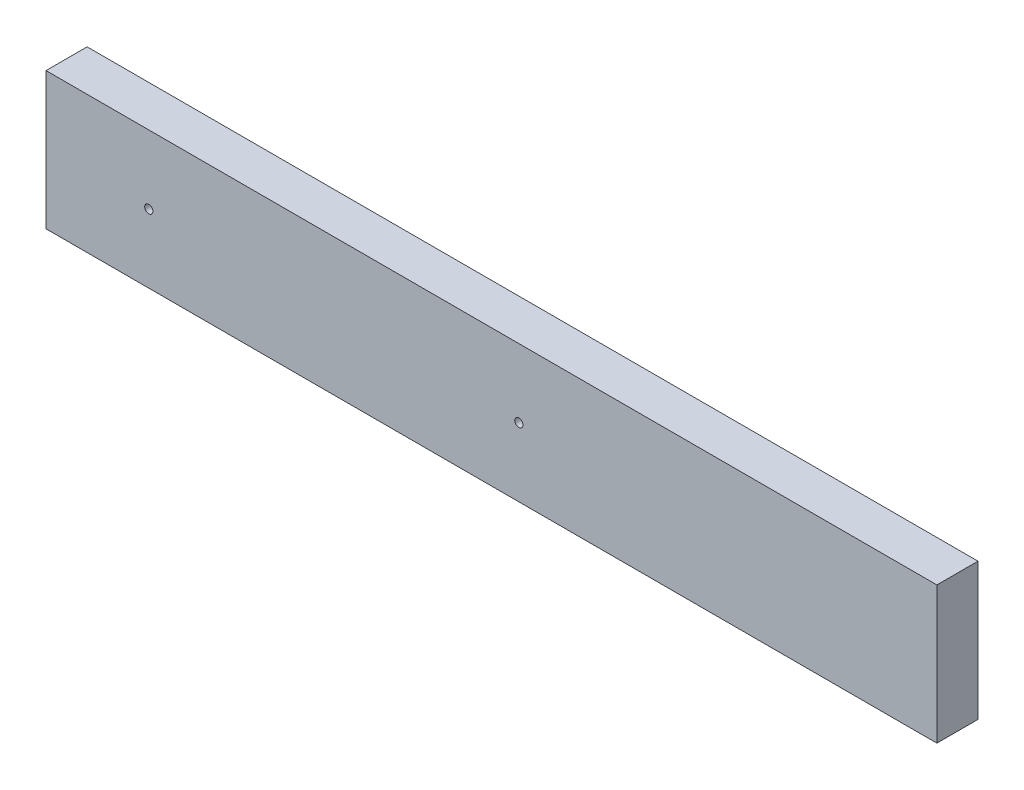
ISO-10303-21;
HEADER;
FILE_DESCRIPTION(('STEP AP214'),'2;1');
FILE_NAME('part.step','',(''),(''),'','','');
FILE_SCHEMA(('AUTOMOTIVE_DESIGN { 1 0 10303 214 1 1 1 1 }'));
ENDSEC;
DATA;
#1=APPLICATION_CONTEXT('core data for automotive mechanical design processes');
#2=APPLICATION_PROTOCOL_DEFINITION('international standard','automotive_design',2000,#1);
#3=PRODUCT_CONTEXT('',#1,'mechanical');
#4=PRODUCT('Part','Part','',(#3));
#5=PRODUCT_RELATED_PRODUCT_CATEGORY('part','',(#4));
#6=PRODUCT_DEFINITION_FORMATION('','',#4);
#7=PRODUCT_DEFINITION_CONTEXT('part definition',#1,'design');
#8=PRODUCT_DEFINITION('design','',#6,#7);
#9=PRODUCT_DEFINITION_SHAPE('','',#8);
#10=(LENGTH_UNIT() NAMED_UNIT(*) SI_UNIT(.MILLI.,.METRE.));
#11=(NAMED_UNIT(*) PLANE_ANGLE_UNIT() SI_UNIT($,.RADIAN.));
#12=(NAMED_UNIT(*) SI_UNIT($,.STERADIAN.) SOLID_ANGLE_UNIT());
#13=UNCERTAINTY_MEASURE_WITH_UNIT(LENGTH_MEASURE(1.E-05),#10,'distance_accuracy_value','');
#14=(GEOMETRIC_REPRESENTATION_CONTEXT(3) GLOBAL_UNCERTAINTY_ASSIGNED_CONTEXT((#13)) GLOBAL_UNIT_ASSIGNED_CONTEXT((#10,
#11,#12)) REPRESENTATION_CONTEXT('',''));
#15=CARTESIAN_POINT('',(0.,0.,0.));
#16=DIRECTION('',(0.,0.,1.));
#17=DIRECTION('',(1.,0.,0.));
#18=AXIS2_PLACEMENT_3D('',#15,#16,#17);
#19=CARTESIAN_POINT('',(325.,50.,30.));
#20=DIRECTION('',(-1.,0.,0.));
#21=DIRECTION('',(0.,0.,1.));
#22=AXIS2_PLACEMENT_3D('',#19,#20,#21);
#23=PLANE('',#22);
#24=DIRECTION('',(0.,1.,0.));
#25=VECTOR('',#24,1.);
#26=CARTESIAN_POINT('',(325.,50.,0.));
#27=LINE('',#26,#25);
#28=CARTESIAN_POINT('',(325.,-50.,0.));
#29=VERTEX_POINT('',#28);
#30=CARTESIAN_POINT('',(325.,50.,0.));
#31=VERTEX_POINT('',#30);
#32=EDGE_CURVE('E107',#29,#31,#27,.T.);
#33=ORIENTED_EDGE('',*,*,#32,.T.);
#34=DIRECTION('',(0.,0.,-1.));
#35=VECTOR('',#34,1.);
#36=CARTESIAN_POINT('',(325.,50.,30.));
#37=LINE('',#36,#35);
#38=CARTESIAN_POINT('',(325.,50.,30.));
#39=VERTEX_POINT('',#38);
#40=EDGE_CURVE('E11',#39,#31,#37,.T.);
#41=ORIENTED_EDGE('',*,*,#40,.F.);
#42=DIRECTION('',(0.,1.,0.));
#43=VECTOR('',#42,1.);
#44=CARTESIAN_POINT('',(325.,50.,30.));
#45=LINE('',#44,#43);
#46=CARTESIAN_POINT('',(325.,-50.,30.));
#47=VERTEX_POINT('',#46);
#48=EDGE_CURVE('E91',#47,#39,#45,.T.);
#49=ORIENTED_EDGE('',*,*,#48,.F.);
#50=DIRECTION('',(0.,0.,-1.));
#51=VECTOR('',#50,1.);
#52=CARTESIAN_POINT('',(325.,-50.,30.));
#53=LINE('',#52,#51);
#54=EDGE_CURVE('E103',#47,#29,#53,.T.);
#55=ORIENTED_EDGE('',*,*,#54,.T.);
#56=EDGE_LOOP('',(#33,#41,#49,#55));
#57=FACE_BOUND('',#56,.T.);
#58=ADVANCED_FACE('F39',(#57),#23,.F.);
#59=CARTESIAN_POINT('',(-325.,50.,30.));
#60=DIRECTION('',(0.,-1.,0.));
#61=DIRECTION('',(0.,0.,-1.));
#62=AXIS2_PLACEMENT_3D('',#59,#60,#61);
#63=PLANE('',#62);
#64=DIRECTION('',(-1.,0.,0.));
#65=VECTOR('',#64,1.);
#66=CARTESIAN_POINT('',(-325.,50.,0.));
#67=LINE('',#66,#65);
#68=CARTESIAN_POINT('',(-325.,50.,0.));
#69=VERTEX_POINT('',#68);
#70=EDGE_CURVE('E96',#31,#69,#67,.T.);
#71=ORIENTED_EDGE('',*,*,#70,.T.);
#72=DIRECTION('',(0.,0.,-1.));
#73=VECTOR('',#72,1.);
#74=CARTESIAN_POINT('',(-325.,50.,30.));
#75=LINE('',#74,#73);
#76=CARTESIAN_POINT('',(-325.,50.,30.));
#77=VERTEX_POINT('',#76);
#78=EDGE_CURVE('E48',#77,#69,#75,.T.);
#79=ORIENTED_EDGE('',*,*,#78,.F.);
#80=DIRECTION('',(-1.,0.,0.));
#81=VECTOR('',#80,1.);
#82=CARTESIAN_POINT('',(-325.,50.,30.));
#83=LINE('',#82,#81);
#84=EDGE_CURVE('E86',#39,#77,#83,.T.);
#85=ORIENTED_EDGE('',*,*,#84,.F.);
#86=ORIENTED_EDGE('',*,*,#40,.T.);
#87=EDGE_LOOP('',(#71,#79,#85,#86));
#88=FACE_BOUND('',#87,.T.);
#89=ADVANCED_FACE('F95',(#88),#63,.F.);
#90=CARTESIAN_POINT('',(-325.,50.,30.));
#91=DIRECTION('',(1.,0.,0.));
#92=DIRECTION('',(0.,0.,-1.));
#93=AXIS2_PLACEMENT_3D('',#90,#91,#92);
#94=PLANE('',#93);
#95=DIRECTION('',(0.,-1.,0.));
#96=VECTOR('',#95,1.);
#97=CARTESIAN_POINT('',(-325.,50.,0.));
#98=LINE('',#97,#96);
#99=CARTESIAN_POINT('',(-325.,-50.,0.));
#100=VERTEX_POINT('',#99);
#101=EDGE_CURVE('E73',#69,#100,#98,.T.);
#102=ORIENTED_EDGE('',*,*,#101,.T.);
#103=DIRECTION('',(0.,0.,-1.));
#104=VECTOR('',#103,1.);
#105=CARTESIAN_POINT('',(-325.,-50.,30.));
#106=LINE('',#105,#104);
#107=CARTESIAN_POINT('',(-325.,-50.,30.));
#108=VERTEX_POINT('',#107);
#109=EDGE_CURVE('E98',#108,#100,#106,.T.);
#110=ORIENTED_EDGE('',*,*,#109,.F.);
#111=DIRECTION('',(0.,-1.,0.));
#112=VECTOR('',#111,1.);
#113=CARTESIAN_POINT('',(-325.,50.,30.));
#114=LINE('',#113,#112);
#115=EDGE_CURVE('E89',#77,#108,#114,.T.);
#116=ORIENTED_EDGE('',*,*,#115,.F.);
#117=ORIENTED_EDGE('',*,*,#78,.T.);
#118=EDGE_LOOP('',(#102,#110,#116,#117));
#119=FACE_BOUND('',#118,.T.);
#120=ADVANCED_FACE('F99',(#119),#94,.F.);
#121=CARTESIAN_POINT('',(-325.,-50.,30.));
#122=DIRECTION('',(0.,1.,0.));
#123=DIRECTION('',(0.,0.,1.));
#124=AXIS2_PLACEMENT_3D('',#121,#122,#123);
#125=PLANE('',#124);
#126=DIRECTION('',(1.,0.,0.));
#127=VECTOR('',#126,1.);
#128=CARTESIAN_POINT('',(-325.,-50.,0.));
#129=LINE('',#128,#127);
#130=EDGE_CURVE('E79',#100,#29,#129,.T.);
#131=ORIENTED_EDGE('',*,*,#130,.T.);
#132=ORIENTED_EDGE('',*,*,#54,.F.);
#133=DIRECTION('',(1.,0.,0.));
#134=VECTOR('',#133,1.);
#135=CARTESIAN_POINT('',(-325.,-50.,30.));
#136=LINE('',#135,#134);
#137=EDGE_CURVE('E56',#108,#47,#136,.T.);
#138=ORIENTED_EDGE('',*,*,#137,.F.);
#139=ORIENTED_EDGE('',*,*,#109,.T.);
#140=EDGE_LOOP('',(#131,#132,#138,#139));
#141=FACE_BOUND('',#140,.T.);
#142=ADVANCED_FACE('F121',(#141),#125,.F.);
#143=CARTESIAN_POINT('',(0.,0.,30.));
#144=DIRECTION('',(0.,0.,1.));
#145=DIRECTION('',(1.,0.,0.));
#146=AXIS2_PLACEMENT_3D('',#143,#144,#145);
#147=PLANE('',#146);
#148=CARTESIAN_POINT('',(20.,0.,30.));
#149=DIRECTION('',(0.,0.,1.));
#150=DIRECTION('',(1.,0.,0.));
#151=AXIS2_PLACEMENT_3D('',#148,#149,#150);
#152=CIRCLE('',#151,3.00000000000001);
#153=CARTESIAN_POINT('',(23.,0.,30.));
#154=VERTEX_POINT('',#153);
#155=EDGE_CURVE('E111',#154,#154,#152,.T.);
#156=ORIENTED_EDGE('',*,*,#155,.F.);
#157=EDGE_LOOP('',(#156));
#158=FACE_BOUND('',#157,.T.);
#159=CARTESIAN_POINT('',(-250.,0.,30.));
#160=DIRECTION('',(0.,0.,1.));
#161=DIRECTION('',(1.,0.,0.));
#162=AXIS2_PLACEMENT_3D('',#159,#160,#161);
#163=CIRCLE('',#162,2.99999999999999);
#164=CARTESIAN_POINT('',(-247.,0.,30.));
#165=VERTEX_POINT('',#164);
#166=EDGE_CURVE('E132',#165,#165,#163,.T.);
#167=ORIENTED_EDGE('',*,*,#166,.F.);
#168=EDGE_LOOP('',(#167));
#169=FACE_BOUND('',#168,.T.);
#170=ORIENTED_EDGE('',*,*,#48,.T.);
#171=ORIENTED_EDGE('',*,*,#84,.T.);
#172=ORIENTED_EDGE('',*,*,#115,.T.);
#173=ORIENTED_EDGE('',*,*,#137,.T.);
#174=EDGE_LOOP('',(#170,#171,#172,#173));
#175=FACE_BOUND('',#174,.T.);
#176=ADVANCED_FACE('F87',(#158,#169,#175),#147,.T.);
#177=CARTESIAN_POINT('',(0.,0.,0.));
#178=DIRECTION('',(0.,0.,1.));
#179=DIRECTION('',(1.,0.,0.));
#180=AXIS2_PLACEMENT_3D('',#177,#178,#179);
#181=PLANE('',#180);
#182=CARTESIAN_POINT('',(20.,0.,0.));
#183=DIRECTION('',(0.,0.,1.));
#184=DIRECTION('',(1.,0.,0.));
#185=AXIS2_PLACEMENT_3D('',#182,#183,#184);
#186=CIRCLE('',#185,3.00000000000001);
#187=CARTESIAN_POINT('',(23.,0.,0.));
#188=VERTEX_POINT('',#187);
#189=EDGE_CURVE('E136',#188,#188,#186,.T.);
#190=ORIENTED_EDGE('',*,*,#189,.T.);
#191=EDGE_LOOP('',(#190));
#192=FACE_BOUND('',#191,.T.);
#193=CARTESIAN_POINT('',(-250.,0.,0.));
#194=DIRECTION('',(0.,0.,1.));
#195=DIRECTION('',(1.,0.,0.));
#196=AXIS2_PLACEMENT_3D('',#193,#194,#195);
#197=CIRCLE('',#196,2.99999999999999);
#198=CARTESIAN_POINT('',(-247.,0.,0.));
#199=VERTEX_POINT('',#198);
#200=EDGE_CURVE('E128',#199,#199,#197,.T.);
#201=ORIENTED_EDGE('',*,*,#200,.T.);
#202=EDGE_LOOP('',(#201));
#203=FACE_BOUND('',#202,.T.);
#204=ORIENTED_EDGE('',*,*,#32,.F.);
#205=ORIENTED_EDGE('',*,*,#130,.F.);
#206=ORIENTED_EDGE('',*,*,#101,.F.);
#207=ORIENTED_EDGE('',*,*,#70,.F.);
#208=EDGE_LOOP('',(#204,#205,#206,#207));
#209=FACE_BOUND('',#208,.T.);
#210=ADVANCED_FACE('F124',(#192,#203,#209),#181,.F.);
#211=CARTESIAN_POINT('',(-250.,0.,30.));
#212=DIRECTION('',(0.,0.,-1.));
#213=DIRECTION('',(-1.,0.,0.));
#214=AXIS2_PLACEMENT_3D('',#211,#212,#213);
#215=CYLINDRICAL_SURFACE('',#214,2.99999999999999);
#216=ORIENTED_EDGE('',*,*,#166,.T.);
#217=EDGE_LOOP('',(#216));
#218=FACE_BOUND('',#217,.T.);
#219=ORIENTED_EDGE('',*,*,#200,.F.);
#220=EDGE_LOOP('',(#219));
#221=FACE_BOUND('',#220,.T.);
#222=ADVANCED_FACE('F152',(#218,#221),#215,.F.);
#223=CARTESIAN_POINT('',(20.,0.,30.));
#224=DIRECTION('',(0.,0.,-1.));
#225=DIRECTION('',(-1.,0.,0.));
#226=AXIS2_PLACEMENT_3D('',#223,#224,#225);
#227=CYLINDRICAL_SURFACE('',#226,3.00000000000001);
#228=ORIENTED_EDGE('',*,*,#155,.T.);
#229=EDGE_LOOP('',(#228));
#230=FACE_BOUND('',#229,.T.);
#231=ORIENTED_EDGE('',*,*,#189,.F.);
#232=EDGE_LOOP('',(#231));
#233=FACE_BOUND('',#232,.T.);
#234=ADVANCED_FACE('F144',(#230,#233),#227,.F.);
#235=CLOSED_SHELL('',(#58,#89,#120,#142,#176,#210,#222,#234));
#236=MANIFOLD_SOLID_BREP('B2',#235);
#237=ADVANCED_BREP_SHAPE_REPRESENTATION('',(#18,#236),#14);
#238=SHAPE_DEFINITION_REPRESENTATION(#9,#237);
ENDSEC;
END-ISO-10303-21;
